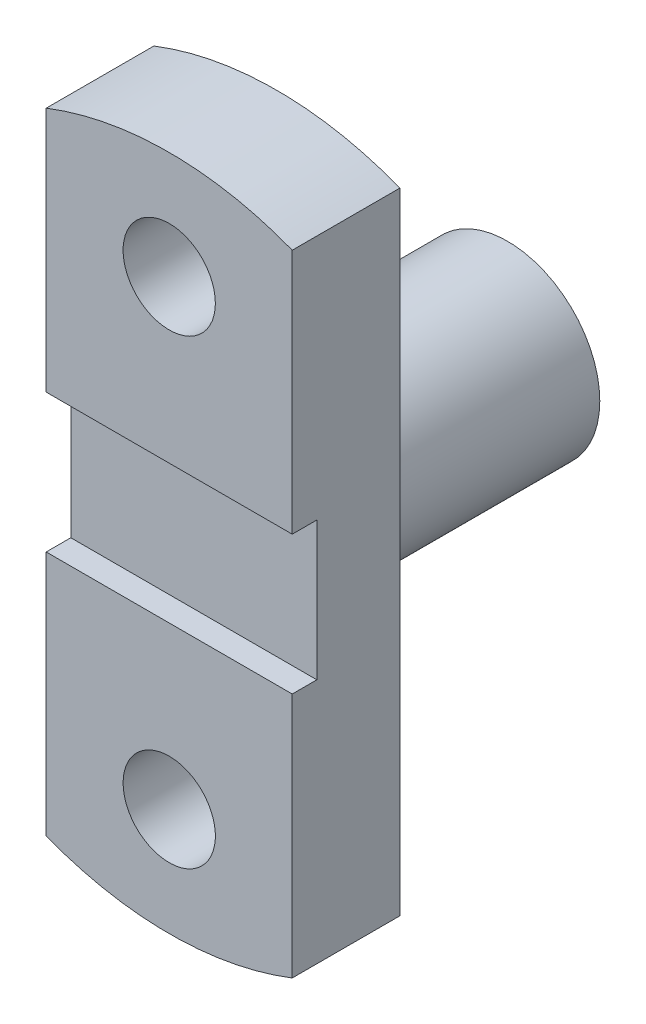
ISO-10303-21;
HEADER;
FILE_DESCRIPTION(('STEP AP214'),'2;1');
FILE_NAME('part.step','',(''),(''),'','','');
FILE_SCHEMA(('AUTOMOTIVE_DESIGN { 1 0 10303 214 1 1 1 1 }'));
ENDSEC;
DATA;
#1=APPLICATION_CONTEXT('core data for automotive mechanical design processes');
#2=APPLICATION_PROTOCOL_DEFINITION('international standard','automotive_design',2000,#1);
#3=PRODUCT_CONTEXT('',#1,'mechanical');
#4=PRODUCT('Part','Part','',(#3));
#5=PRODUCT_RELATED_PRODUCT_CATEGORY('part','',(#4));
#6=PRODUCT_DEFINITION_FORMATION('','',#4);
#7=PRODUCT_DEFINITION_CONTEXT('part definition',#1,'design');
#8=PRODUCT_DEFINITION('design','',#6,#7);
#9=PRODUCT_DEFINITION_SHAPE('','',#8);
#10=(LENGTH_UNIT() NAMED_UNIT(*) SI_UNIT(.MILLI.,.METRE.));
#11=(NAMED_UNIT(*) PLANE_ANGLE_UNIT() SI_UNIT($,.RADIAN.));
#12=(NAMED_UNIT(*) SI_UNIT($,.STERADIAN.) SOLID_ANGLE_UNIT());
#13=UNCERTAINTY_MEASURE_WITH_UNIT(LENGTH_MEASURE(1.E-05),#10,'distance_accuracy_value','');
#14=(GEOMETRIC_REPRESENTATION_CONTEXT(3) GLOBAL_UNCERTAINTY_ASSIGNED_CONTEXT((#13)) GLOBAL_UNIT_ASSIGNED_CONTEXT((#10,
#11,#12)) REPRESENTATION_CONTEXT('',''));
#15=CARTESIAN_POINT('',(0.,0.,0.));
#16=DIRECTION('',(0.,0.,1.));
#17=DIRECTION('',(1.,0.,0.));
#18=AXIS2_PLACEMENT_3D('',#15,#16,#17);
#19=CARTESIAN_POINT('',(0.,0.,35.));
#20=DIRECTION('',(0.,0.,1.));
#21=DIRECTION('',(1.,0.,0.));
#22=AXIS2_PLACEMENT_3D('',#19,#20,#21);
#23=PLANE('',#22);
#24=DIRECTION('',(1.,0.,0.));
#25=VECTOR('',#24,1.);
#26=CARTESIAN_POINT('',(-40.,-22.5,35.));
#27=LINE('',#26,#25);
#28=CARTESIAN_POINT('',(-40.,-22.5,35.));
#29=VERTEX_POINT('',#28);
#30=CARTESIAN_POINT('',(40.,-22.5,35.));
#31=VERTEX_POINT('',#30);
#32=EDGE_CURVE('E132',#29,#31,#27,.T.);
#33=ORIENTED_EDGE('',*,*,#32,.F.);
#34=DIRECTION('',(0.,-1.,0.));
#35=VECTOR('',#34,1.);
#36=CARTESIAN_POINT('',(-40.,102.469507659596,35.));
#37=LINE('',#36,#35);
#38=CARTESIAN_POINT('',(-40.,-102.469507659596,35.));
#39=VERTEX_POINT('',#38);
#40=EDGE_CURVE('E64',#29,#39,#37,.T.);
#41=ORIENTED_EDGE('',*,*,#40,.T.);
#42=CARTESIAN_POINT('',(0.,0.,35.));
#43=DIRECTION('',(0.,0.,1.));
#44=DIRECTION('',(1.,0.,0.));
#45=AXIS2_PLACEMENT_3D('',#42,#43,#44);
#46=CIRCLE('',#45,110.);
#47=CARTESIAN_POINT('',(40.,-102.469507659596,35.));
#48=VERTEX_POINT('',#47);
#49=EDGE_CURVE('E165',#39,#48,#46,.T.);
#50=ORIENTED_EDGE('',*,*,#49,.T.);
#51=DIRECTION('',(0.,1.,0.));
#52=VECTOR('',#51,1.);
#53=CARTESIAN_POINT('',(40.,102.469507659596,35.));
#54=LINE('',#53,#52);
#55=EDGE_CURVE('E94',#48,#31,#54,.T.);
#56=ORIENTED_EDGE('',*,*,#55,.T.);
#57=EDGE_LOOP('',(#33,#41,#50,#56));
#58=FACE_BOUND('',#57,.T.);
#59=CARTESIAN_POINT('',(0.,-75.,35.));
#60=DIRECTION('',(0.,0.,1.));
#61=DIRECTION('',(-1.,0.,0.));
#62=AXIS2_PLACEMENT_3D('',#59,#60,#61);
#63=CIRCLE('',#62,15.);
#64=CARTESIAN_POINT('',(-15.,-75.,35.));
#65=VERTEX_POINT('',#64);
#66=EDGE_CURVE('E147',#65,#65,#63,.T.);
#67=ORIENTED_EDGE('',*,*,#66,.F.);
#68=EDGE_LOOP('',(#67));
#69=FACE_BOUND('',#68,.T.);
#70=ADVANCED_FACE('F39',(#58,#69),#23,.T.);
#71=DIRECTION('',(-1.,0.,0.));
#72=VECTOR('',#71,1.);
#73=CARTESIAN_POINT('',(-40.,22.5,35.));
#74=LINE('',#73,#72);
#75=CARTESIAN_POINT('',(40.,22.5,35.));
#76=VERTEX_POINT('',#75);
#77=CARTESIAN_POINT('',(-40.,22.5,35.));
#78=VERTEX_POINT('',#77);
#79=EDGE_CURVE('E215',#76,#78,#74,.T.);
#80=ORIENTED_EDGE('',*,*,#79,.F.);
#81=CARTESIAN_POINT('',(40.,102.469507659596,35.));
#82=VERTEX_POINT('',#81);
#83=EDGE_CURVE('E137',#76,#82,#54,.T.);
#84=ORIENTED_EDGE('',*,*,#83,.T.);
#85=CARTESIAN_POINT('',(0.,0.,35.));
#86=DIRECTION('',(0.,0.,1.));
#87=DIRECTION('',(1.,0.,0.));
#88=AXIS2_PLACEMENT_3D('',#85,#86,#87);
#89=CIRCLE('',#88,110.);
#90=CARTESIAN_POINT('',(-40.,102.469507659596,35.));
#91=VERTEX_POINT('',#90);
#92=EDGE_CURVE('E170',#82,#91,#89,.T.);
#93=ORIENTED_EDGE('',*,*,#92,.T.);
#94=EDGE_CURVE('E173',#91,#78,#37,.T.);
#95=ORIENTED_EDGE('',*,*,#94,.T.);
#96=EDGE_LOOP('',(#80,#84,#93,#95));
#97=FACE_BOUND('',#96,.T.);
#98=CARTESIAN_POINT('',(0.,75.,35.));
#99=DIRECTION('',(0.,0.,1.));
#100=DIRECTION('',(1.,0.,0.));
#101=AXIS2_PLACEMENT_3D('',#98,#99,#100);
#102=CIRCLE('',#101,15.);
#103=CARTESIAN_POINT('',(15.,75.,35.));
#104=VERTEX_POINT('',#103);
#105=EDGE_CURVE('E157',#104,#104,#102,.T.);
#106=ORIENTED_EDGE('',*,*,#105,.F.);
#107=EDGE_LOOP('',(#106));
#108=FACE_BOUND('',#107,.T.);
#109=ADVANCED_FACE('F213',(#97,#108),#23,.T.);
#110=CARTESIAN_POINT('',(0.,0.,0.));
#111=DIRECTION('',(0.,0.,1.));
#112=DIRECTION('',(1.,0.,0.));
#113=AXIS2_PLACEMENT_3D('',#110,#111,#112);
#114=PLANE('',#113);
#115=CARTESIAN_POINT('',(0.,0.,0.));
#116=DIRECTION('',(0.,0.,1.));
#117=DIRECTION('',(1.,0.,0.));
#118=AXIS2_PLACEMENT_3D('',#115,#116,#117);
#119=CIRCLE('',#118,30.);
#120=CARTESIAN_POINT('',(30.,0.,0.));
#121=VERTEX_POINT('',#120);
#122=EDGE_CURVE('E11',#121,#121,#119,.F.);
#123=ORIENTED_EDGE('',*,*,#122,.F.);
#124=EDGE_LOOP('',(#123));
#125=FACE_BOUND('',#124,.T.);
#126=CARTESIAN_POINT('',(0.,0.,0.));
#127=DIRECTION('',(0.,0.,1.));
#128=DIRECTION('',(1.,0.,0.));
#129=AXIS2_PLACEMENT_3D('',#126,#127,#128);
#130=CIRCLE('',#129,110.);
#131=CARTESIAN_POINT('',(-40.,-102.469507659596,0.));
#132=VERTEX_POINT('',#131);
#133=CARTESIAN_POINT('',(40.,-102.469507659596,0.));
#134=VERTEX_POINT('',#133);
#135=EDGE_CURVE('E161',#132,#134,#130,.T.);
#136=ORIENTED_EDGE('',*,*,#135,.F.);
#137=DIRECTION('',(0.,-1.,0.));
#138=VECTOR('',#137,1.);
#139=CARTESIAN_POINT('',(-40.,102.469507659596,0.));
#140=LINE('',#139,#138);
#141=CARTESIAN_POINT('',(-40.,102.469507659596,0.));
#142=VERTEX_POINT('',#141);
#143=EDGE_CURVE('E86',#142,#132,#140,.T.);
#144=ORIENTED_EDGE('',*,*,#143,.F.);
#145=CARTESIAN_POINT('',(0.,0.,0.));
#146=DIRECTION('',(0.,0.,1.));
#147=DIRECTION('',(1.,0.,0.));
#148=AXIS2_PLACEMENT_3D('',#145,#146,#147);
#149=CIRCLE('',#148,110.);
#150=CARTESIAN_POINT('',(40.,102.469507659596,0.));
#151=VERTEX_POINT('',#150);
#152=EDGE_CURVE('E184',#151,#142,#149,.T.);
#153=ORIENTED_EDGE('',*,*,#152,.F.);
#154=DIRECTION('',(0.,1.,0.));
#155=VECTOR('',#154,1.);
#156=CARTESIAN_POINT('',(40.,102.469507659596,0.));
#157=LINE('',#156,#155);
#158=EDGE_CURVE('E181',#134,#151,#157,.T.);
#159=ORIENTED_EDGE('',*,*,#158,.F.);
#160=EDGE_LOOP('',(#136,#144,#153,#159));
#161=FACE_BOUND('',#160,.T.);
#162=CARTESIAN_POINT('',(0.,75.,0.));
#163=DIRECTION('',(0.,0.,1.));
#164=DIRECTION('',(1.,0.,0.));
#165=AXIS2_PLACEMENT_3D('',#162,#163,#164);
#166=CIRCLE('',#165,15.);
#167=CARTESIAN_POINT('',(15.,75.,0.));
#168=VERTEX_POINT('',#167);
#169=EDGE_CURVE('E151',#168,#168,#166,.T.);
#170=ORIENTED_EDGE('',*,*,#169,.T.);
#171=EDGE_LOOP('',(#170));
#172=FACE_BOUND('',#171,.T.);
#173=CARTESIAN_POINT('',(0.,-75.,0.));
#174=DIRECTION('',(0.,0.,1.));
#175=DIRECTION('',(-1.,0.,0.));
#176=AXIS2_PLACEMENT_3D('',#173,#174,#175);
#177=CIRCLE('',#176,15.);
#178=CARTESIAN_POINT('',(-15.,-75.,0.));
#179=VERTEX_POINT('',#178);
#180=EDGE_CURVE('E152',#179,#179,#177,.T.);
#181=ORIENTED_EDGE('',*,*,#180,.T.);
#182=EDGE_LOOP('',(#181));
#183=FACE_BOUND('',#182,.T.);
#184=ADVANCED_FACE('F203',(#125,#161,#172,#183),#114,.F.);
#185=CARTESIAN_POINT('',(0.,0.,35.));
#186=DIRECTION('',(0.,0.,-1.));
#187=DIRECTION('',(-1.,0.,0.));
#188=AXIS2_PLACEMENT_3D('',#185,#186,#187);
#189=CYLINDRICAL_SURFACE('',#188,110.);
#190=ORIENTED_EDGE('',*,*,#135,.T.);
#191=DIRECTION('',(0.,0.,-1.));
#192=VECTOR('',#191,1.);
#193=CARTESIAN_POINT('',(40.,-102.469507659596,35.));
#194=LINE('',#193,#192);
#195=EDGE_CURVE('E48',#48,#134,#194,.T.);
#196=ORIENTED_EDGE('',*,*,#195,.F.);
#197=ORIENTED_EDGE('',*,*,#49,.F.);
#198=DIRECTION('',(0.,0.,-1.));
#199=VECTOR('',#198,1.);
#200=CARTESIAN_POINT('',(-40.,-102.469507659596,35.));
#201=LINE('',#200,#199);
#202=EDGE_CURVE('E177',#39,#132,#201,.T.);
#203=ORIENTED_EDGE('',*,*,#202,.T.);
#204=EDGE_LOOP('',(#190,#196,#197,#203));
#205=FACE_BOUND('',#204,.T.);
#206=ADVANCED_FACE('F41',(#205),#189,.T.);
#207=CARTESIAN_POINT('',(40.,102.469507659596,35.));
#208=DIRECTION('',(-1.,0.,0.));
#209=DIRECTION('',(0.,0.,1.));
#210=AXIS2_PLACEMENT_3D('',#207,#208,#209);
#211=PLANE('',#210);
#212=DIRECTION('',(0.,1.,0.));
#213=VECTOR('',#212,1.);
#214=CARTESIAN_POINT('',(40.,-22.5,27.));
#215=LINE('',#214,#213);
#216=CARTESIAN_POINT('',(40.,-22.5,27.));
#217=VERTEX_POINT('',#216);
#218=CARTESIAN_POINT('',(40.,22.5,27.));
#219=VERTEX_POINT('',#218);
#220=EDGE_CURVE('E124',#217,#219,#215,.T.);
#221=ORIENTED_EDGE('',*,*,#220,.F.);
#222=DIRECTION('',(0.,0.,1.));
#223=VECTOR('',#222,1.);
#224=CARTESIAN_POINT('',(40.,-22.5,27.));
#225=LINE('',#224,#223);
#226=EDGE_CURVE('E156',#217,#31,#225,.T.);
#227=ORIENTED_EDGE('',*,*,#226,.T.);
#228=ORIENTED_EDGE('',*,*,#55,.F.);
#229=ORIENTED_EDGE('',*,*,#195,.T.);
#230=ORIENTED_EDGE('',*,*,#158,.T.);
#231=DIRECTION('',(0.,0.,-1.));
#232=VECTOR('',#231,1.);
#233=CARTESIAN_POINT('',(40.,102.469507659596,35.));
#234=LINE('',#233,#232);
#235=EDGE_CURVE('E194',#82,#151,#234,.T.);
#236=ORIENTED_EDGE('',*,*,#235,.F.);
#237=ORIENTED_EDGE('',*,*,#83,.F.);
#238=DIRECTION('',(0.,0.,1.));
#239=VECTOR('',#238,1.);
#240=CARTESIAN_POINT('',(40.,22.5,27.));
#241=LINE('',#240,#239);
#242=EDGE_CURVE('E117',#219,#76,#241,.T.);
#243=ORIENTED_EDGE('',*,*,#242,.F.);
#244=EDGE_LOOP('',(#221,#227,#228,#229,#230,#236,#237,#243));
#245=FACE_BOUND('',#244,.T.);
#246=ADVANCED_FACE('F135',(#245),#211,.F.);
#247=CARTESIAN_POINT('',(0.,0.,35.));
#248=DIRECTION('',(0.,0.,-1.));
#249=DIRECTION('',(-1.,0.,0.));
#250=AXIS2_PLACEMENT_3D('',#247,#248,#249);
#251=CYLINDRICAL_SURFACE('',#250,110.);
#252=ORIENTED_EDGE('',*,*,#152,.T.);
#253=DIRECTION('',(0.,0.,-1.));
#254=VECTOR('',#253,1.);
#255=CARTESIAN_POINT('',(-40.,102.469507659596,35.));
#256=LINE('',#255,#254);
#257=EDGE_CURVE('E191',#91,#142,#256,.T.);
#258=ORIENTED_EDGE('',*,*,#257,.F.);
#259=ORIENTED_EDGE('',*,*,#92,.F.);
#260=ORIENTED_EDGE('',*,*,#235,.T.);
#261=EDGE_LOOP('',(#252,#258,#259,#260));
#262=FACE_BOUND('',#261,.T.);
#263=ADVANCED_FACE('F208',(#262),#251,.T.);
#264=CARTESIAN_POINT('',(-40.,102.469507659596,35.));
#265=DIRECTION('',(1.,0.,0.));
#266=DIRECTION('',(0.,0.,-1.));
#267=AXIS2_PLACEMENT_3D('',#264,#265,#266);
#268=PLANE('',#267);
#269=ORIENTED_EDGE('',*,*,#40,.F.);
#270=DIRECTION('',(0.,0.,1.));
#271=VECTOR('',#270,1.);
#272=CARTESIAN_POINT('',(-40.,-22.5,27.));
#273=LINE('',#272,#271);
#274=CARTESIAN_POINT('',(-40.,-22.5,27.));
#275=VERTEX_POINT('',#274);
#276=EDGE_CURVE('E142',#275,#29,#273,.T.);
#277=ORIENTED_EDGE('',*,*,#276,.F.);
#278=DIRECTION('',(0.,-1.,0.));
#279=VECTOR('',#278,1.);
#280=CARTESIAN_POINT('',(-40.,-22.5,27.));
#281=LINE('',#280,#279);
#282=CARTESIAN_POINT('',(-40.,22.5,27.));
#283=VERTEX_POINT('',#282);
#284=EDGE_CURVE('E123',#283,#275,#281,.T.);
#285=ORIENTED_EDGE('',*,*,#284,.F.);
#286=DIRECTION('',(0.,0.,1.));
#287=VECTOR('',#286,1.);
#288=CARTESIAN_POINT('',(-40.,22.5,27.));
#289=LINE('',#288,#287);
#290=EDGE_CURVE('E120',#283,#78,#289,.T.);
#291=ORIENTED_EDGE('',*,*,#290,.T.);
#292=ORIENTED_EDGE('',*,*,#94,.F.);
#293=ORIENTED_EDGE('',*,*,#257,.T.);
#294=ORIENTED_EDGE('',*,*,#143,.T.);
#295=ORIENTED_EDGE('',*,*,#202,.F.);
#296=EDGE_LOOP('',(#269,#277,#285,#291,#292,#293,#294,#295));
#297=FACE_BOUND('',#296,.T.);
#298=ADVANCED_FACE('F211',(#297),#268,.F.);
#299=CARTESIAN_POINT('',(0.,75.,35.));
#300=DIRECTION('',(0.,0.,-1.));
#301=DIRECTION('',(-1.,0.,0.));
#302=AXIS2_PLACEMENT_3D('',#299,#300,#301);
#303=CYLINDRICAL_SURFACE('',#302,15.);
#304=ORIENTED_EDGE('',*,*,#105,.T.);
#305=EDGE_LOOP('',(#304));
#306=FACE_BOUND('',#305,.T.);
#307=ORIENTED_EDGE('',*,*,#169,.F.);
#308=EDGE_LOOP('',(#307));
#309=FACE_BOUND('',#308,.T.);
#310=ADVANCED_FACE('F255',(#306,#309),#303,.F.);
#311=CARTESIAN_POINT('',(0.,-75.,35.));
#312=DIRECTION('',(0.,0.,-1.));
#313=DIRECTION('',(-1.,0.,0.));
#314=AXIS2_PLACEMENT_3D('',#311,#312,#313);
#315=CYLINDRICAL_SURFACE('',#314,15.);
#316=ORIENTED_EDGE('',*,*,#66,.T.);
#317=EDGE_LOOP('',(#316));
#318=FACE_BOUND('',#317,.T.);
#319=ORIENTED_EDGE('',*,*,#180,.F.);
#320=EDGE_LOOP('',(#319));
#321=FACE_BOUND('',#320,.T.);
#322=ADVANCED_FACE('F258',(#318,#321),#315,.F.);
#323=CARTESIAN_POINT('',(-40.,-22.5,27.));
#324=DIRECTION('',(0.,-1.,0.));
#325=DIRECTION('',(0.,0.,-1.));
#326=AXIS2_PLACEMENT_3D('',#323,#324,#325);
#327=PLANE('',#326);
#328=ORIENTED_EDGE('',*,*,#32,.T.);
#329=ORIENTED_EDGE('',*,*,#226,.F.);
#330=DIRECTION('',(1.,0.,0.));
#331=VECTOR('',#330,1.);
#332=CARTESIAN_POINT('',(-40.,-22.5,27.));
#333=LINE('',#332,#331);
#334=EDGE_CURVE('E130',#275,#217,#333,.T.);
#335=ORIENTED_EDGE('',*,*,#334,.F.);
#336=ORIENTED_EDGE('',*,*,#276,.T.);
#337=EDGE_LOOP('',(#328,#329,#335,#336));
#338=FACE_BOUND('',#337,.T.);
#339=ADVANCED_FACE('F262',(#338),#327,.F.);
#340=CARTESIAN_POINT('',(-40.,22.5,27.));
#341=DIRECTION('',(0.,1.,0.));
#342=DIRECTION('',(0.,0.,1.));
#343=AXIS2_PLACEMENT_3D('',#340,#341,#342);
#344=PLANE('',#343);
#345=ORIENTED_EDGE('',*,*,#79,.T.);
#346=ORIENTED_EDGE('',*,*,#290,.F.);
#347=DIRECTION('',(-1.,0.,0.));
#348=VECTOR('',#347,1.);
#349=CARTESIAN_POINT('',(-40.,22.5,27.));
#350=LINE('',#349,#348);
#351=EDGE_CURVE('E55',#219,#283,#350,.T.);
#352=ORIENTED_EDGE('',*,*,#351,.F.);
#353=ORIENTED_EDGE('',*,*,#242,.T.);
#354=EDGE_LOOP('',(#345,#346,#352,#353));
#355=FACE_BOUND('',#354,.T.);
#356=ADVANCED_FACE('F115',(#355),#344,.F.);
#357=CARTESIAN_POINT('',(0.,0.,27.));
#358=DIRECTION('',(0.,0.,-1.));
#359=DIRECTION('',(-1.,0.,0.));
#360=AXIS2_PLACEMENT_3D('',#357,#358,#359);
#361=PLANE('',#360);
#362=ORIENTED_EDGE('',*,*,#220,.T.);
#363=ORIENTED_EDGE('',*,*,#351,.T.);
#364=ORIENTED_EDGE('',*,*,#284,.T.);
#365=ORIENTED_EDGE('',*,*,#334,.T.);
#366=EDGE_LOOP('',(#362,#363,#364,#365));
#367=FACE_BOUND('',#366,.T.);
#368=ADVANCED_FACE('F128',(#367),#361,.F.);
#369=CARTESIAN_POINT('',(0.,0.,-75.));
#370=DIRECTION('',(0.,0.,1.));
#371=DIRECTION('',(1.,0.,0.));
#372=AXIS2_PLACEMENT_3D('',#369,#370,#371);
#373=CYLINDRICAL_SURFACE('',#372,30.);
#374=CARTESIAN_POINT('',(0.,0.,-75.));
#375=DIRECTION('',(0.,0.,-1.));
#376=DIRECTION('',(-1.,0.,0.));
#377=AXIS2_PLACEMENT_3D('',#374,#375,#376);
#378=CIRCLE('',#377,30.);
#379=CARTESIAN_POINT('',(-30.,0.,-75.));
#380=VERTEX_POINT('',#379);
#381=EDGE_CURVE('E226',#380,#380,#378,.T.);
#382=ORIENTED_EDGE('',*,*,#381,.F.);
#383=EDGE_LOOP('',(#382));
#384=FACE_BOUND('',#383,.T.);
#385=ORIENTED_EDGE('',*,*,#122,.T.);
#386=EDGE_LOOP('',(#385));
#387=FACE_BOUND('',#386,.T.);
#388=ADVANCED_FACE('F236',(#384,#387),#373,.T.);
#389=CARTESIAN_POINT('',(0.,0.,-75.));
#390=DIRECTION('',(0.,0.,-1.));
#391=DIRECTION('',(-1.,0.,0.));
#392=AXIS2_PLACEMENT_3D('',#389,#390,#391);
#393=PLANE('',#392);
#394=ORIENTED_EDGE('',*,*,#381,.T.);
#395=EDGE_LOOP('',(#394));
#396=FACE_BOUND('',#395,.T.);
#397=ADVANCED_FACE('F234',(#396),#393,.T.);
#398=CLOSED_SHELL('',(#70,#109,#184,#206,#246,#263,#298,#310,#322,#339,#356,#368,#388,#397));
#399=MANIFOLD_SOLID_BREP('B2',#398);
#400=ADVANCED_BREP_SHAPE_REPRESENTATION('',(#18,#399),#14);
#401=SHAPE_DEFINITION_REPRESENTATION(#9,#400);
ENDSEC;
END-ISO-10303-21;
